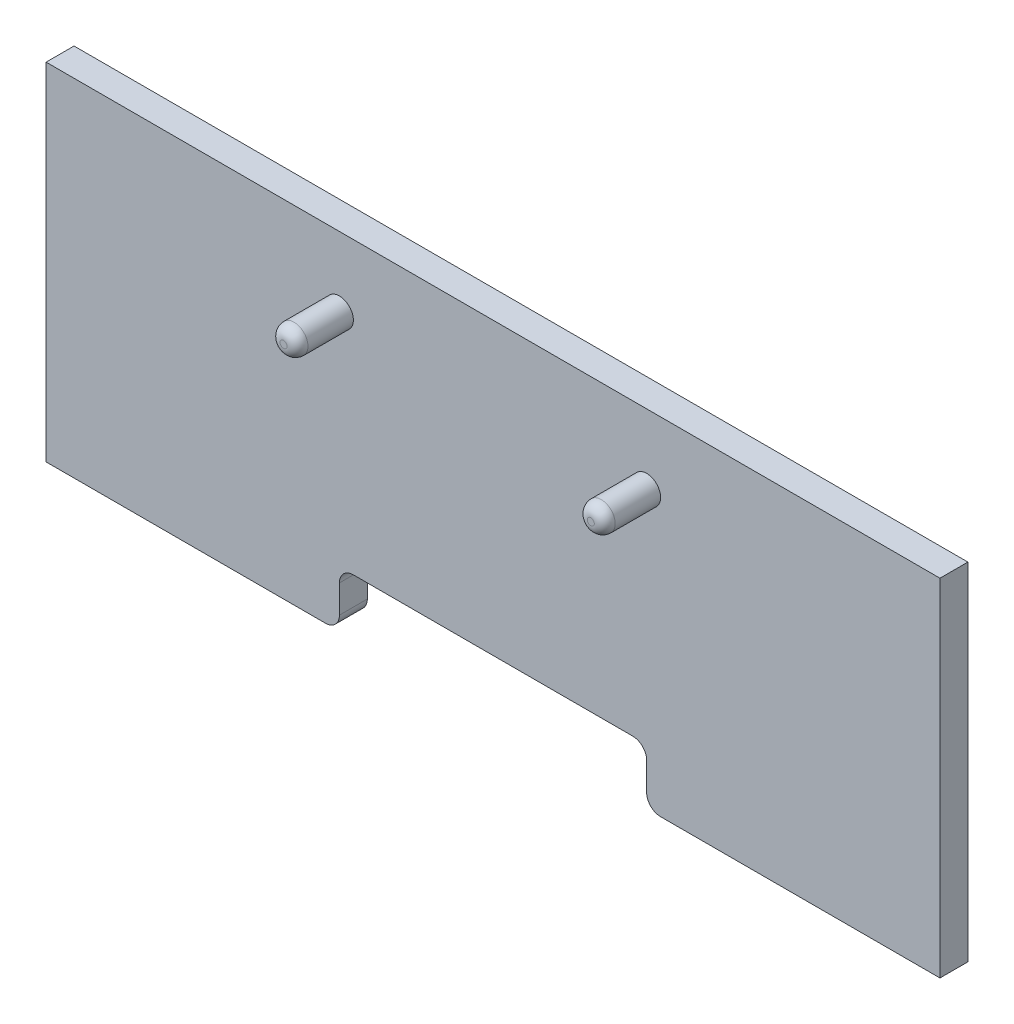
ISO-10303-21;
HEADER;
FILE_DESCRIPTION(('STEP AP214'),'2;1');
FILE_NAME('part.step','',(''),(''),'','','');
FILE_SCHEMA(('AUTOMOTIVE_DESIGN { 1 0 10303 214 1 1 1 1 }'));
ENDSEC;
DATA;
#1=APPLICATION_CONTEXT('core data for automotive mechanical design processes');
#2=APPLICATION_PROTOCOL_DEFINITION('international standard','automotive_design',2000,#1);
#3=PRODUCT_CONTEXT('',#1,'mechanical');
#4=PRODUCT('Part','Part','',(#3));
#5=PRODUCT_RELATED_PRODUCT_CATEGORY('part','',(#4));
#6=PRODUCT_DEFINITION_FORMATION('','',#4);
#7=PRODUCT_DEFINITION_CONTEXT('part definition',#1,'design');
#8=PRODUCT_DEFINITION('design','',#6,#7);
#9=PRODUCT_DEFINITION_SHAPE('','',#8);
#10=(LENGTH_UNIT() NAMED_UNIT(*) SI_UNIT(.MILLI.,.METRE.));
#11=(NAMED_UNIT(*) PLANE_ANGLE_UNIT() SI_UNIT($,.RADIAN.));
#12=(NAMED_UNIT(*) SI_UNIT($,.STERADIAN.) SOLID_ANGLE_UNIT());
#13=UNCERTAINTY_MEASURE_WITH_UNIT(LENGTH_MEASURE(1.E-05),#10,'distance_accuracy_value','');
#14=(GEOMETRIC_REPRESENTATION_CONTEXT(3) GLOBAL_UNCERTAINTY_ASSIGNED_CONTEXT((#13)) GLOBAL_UNIT_ASSIGNED_CONTEXT((#10,
#11,#12)) REPRESENTATION_CONTEXT('',''));
#15=CARTESIAN_POINT('',(0.,0.,0.));
#16=DIRECTION('',(0.,0.,1.));
#17=DIRECTION('',(1.,0.,0.));
#18=AXIS2_PLACEMENT_3D('',#15,#16,#17);
#19=CARTESIAN_POINT('',(0.,0.,6.35));
#20=DIRECTION('',(0.,1.,0.));
#21=DIRECTION('',(0.,0.,1.));
#22=AXIS2_PLACEMENT_3D('',#19,#20,#21);
#23=PLANE('',#22);
#24=DIRECTION('',(1.,0.,0.));
#25=VECTOR('',#24,1.);
#26=CARTESIAN_POINT('',(0.,0.,0.));
#27=LINE('',#26,#25);
#28=CARTESIAN_POINT('',(0.,0.,0.));
#29=VERTEX_POINT('',#28);
#30=CARTESIAN_POINT('',(63.5,0.,0.));
#31=VERTEX_POINT('',#30);
#32=EDGE_CURVE('E309',#29,#31,#27,.T.);
#33=ORIENTED_EDGE('',*,*,#32,.T.);
#34=DIRECTION('',(0.,0.,1.));
#35=VECTOR('',#34,1.);
#36=CARTESIAN_POINT('',(63.5,0.,6.35));
#37=LINE('',#36,#35);
#38=CARTESIAN_POINT('',(63.5,0.,6.35));
#39=VERTEX_POINT('',#38);
#40=EDGE_CURVE('E139',#31,#39,#37,.T.);
#41=ORIENTED_EDGE('',*,*,#40,.T.);
#42=DIRECTION('',(1.,0.,0.));
#43=VECTOR('',#42,1.);
#44=CARTESIAN_POINT('',(0.,0.,6.35));
#45=LINE('',#44,#43);
#46=CARTESIAN_POINT('',(0.,0.,6.35));
#47=VERTEX_POINT('',#46);
#48=EDGE_CURVE('E132',#47,#39,#45,.T.);
#49=ORIENTED_EDGE('',*,*,#48,.F.);
#50=DIRECTION('',(0.,0.,-1.));
#51=VECTOR('',#50,1.);
#52=CARTESIAN_POINT('',(0.,0.,6.35));
#53=LINE('',#52,#51);
#54=EDGE_CURVE('E136',#47,#29,#53,.T.);
#55=ORIENTED_EDGE('',*,*,#54,.T.);
#56=EDGE_LOOP('',(#33,#41,#49,#55));
#57=FACE_BOUND('',#56,.T.);
#58=ADVANCED_FACE('F39',(#57),#23,.F.);
#59=CARTESIAN_POINT('',(0.,0.,6.35));
#60=DIRECTION('',(1.,0.,0.));
#61=DIRECTION('',(0.,0.,-1.));
#62=AXIS2_PLACEMENT_3D('',#59,#60,#61);
#63=PLANE('',#62);
#64=DIRECTION('',(0.,-1.,0.));
#65=VECTOR('',#64,1.);
#66=CARTESIAN_POINT('',(0.,0.,0.));
#67=LINE('',#66,#65);
#68=CARTESIAN_POINT('',(0.,78.7146,0.));
#69=VERTEX_POINT('',#68);
#70=EDGE_CURVE('E159',#69,#29,#67,.T.);
#71=ORIENTED_EDGE('',*,*,#70,.T.);
#72=ORIENTED_EDGE('',*,*,#54,.F.);
#73=DIRECTION('',(0.,-1.,0.));
#74=VECTOR('',#73,1.);
#75=CARTESIAN_POINT('',(0.,0.,6.35));
#76=LINE('',#75,#74);
#77=CARTESIAN_POINT('',(0.,78.7146,6.35));
#78=VERTEX_POINT('',#77);
#79=EDGE_CURVE('E146',#78,#47,#76,.T.);
#80=ORIENTED_EDGE('',*,*,#79,.F.);
#81=DIRECTION('',(0.,0.,-1.));
#82=VECTOR('',#81,1.);
#83=CARTESIAN_POINT('',(0.,78.7146,6.35));
#84=LINE('',#83,#82);
#85=EDGE_CURVE('E306',#78,#69,#84,.T.);
#86=ORIENTED_EDGE('',*,*,#85,.T.);
#87=EDGE_LOOP('',(#71,#72,#80,#86));
#88=FACE_BOUND('',#87,.T.);
#89=ADVANCED_FACE('F157',(#88),#63,.F.);
#90=CARTESIAN_POINT('',(139.7,0.,6.35));
#91=VERTEX_POINT('',#90);
#92=CARTESIAN_POINT('',(203.2,0.,6.35));
#93=VERTEX_POINT('',#92);
#94=EDGE_CURVE('E143',#91,#93,#45,.T.);
#95=ORIENTED_EDGE('',*,*,#94,.F.);
#96=DIRECTION('',(0.,0.,1.));
#97=VECTOR('',#96,1.);
#98=CARTESIAN_POINT('',(139.7,0.,6.35));
#99=LINE('',#98,#97);
#100=CARTESIAN_POINT('',(139.7,0.,0.));
#101=VERTEX_POINT('',#100);
#102=EDGE_CURVE('E182',#91,#101,#99,.F.);
#103=ORIENTED_EDGE('',*,*,#102,.T.);
#104=CARTESIAN_POINT('',(203.2,0.,0.));
#105=VERTEX_POINT('',#104);
#106=EDGE_CURVE('E277',#101,#105,#27,.T.);
#107=ORIENTED_EDGE('',*,*,#106,.T.);
#108=DIRECTION('',(0.,0.,-1.));
#109=VECTOR('',#108,1.);
#110=CARTESIAN_POINT('',(203.2,0.,6.35));
#111=LINE('',#110,#109);
#112=EDGE_CURVE('E162',#93,#105,#111,.T.);
#113=ORIENTED_EDGE('',*,*,#112,.F.);
#114=EDGE_LOOP('',(#95,#103,#107,#113));
#115=FACE_BOUND('',#114,.T.);
#116=ADVANCED_FACE('F249',(#115),#23,.F.);
#117=CARTESIAN_POINT('',(203.2,0.,6.35));
#118=DIRECTION('',(-1.,0.,0.));
#119=DIRECTION('',(0.,0.,1.));
#120=AXIS2_PLACEMENT_3D('',#117,#118,#119);
#121=PLANE('',#120);
#122=DIRECTION('',(0.,1.,0.));
#123=VECTOR('',#122,1.);
#124=CARTESIAN_POINT('',(203.2,0.,0.));
#125=LINE('',#124,#123);
#126=CARTESIAN_POINT('',(203.2,78.7146,0.));
#127=VERTEX_POINT('',#126);
#128=EDGE_CURVE('E312',#105,#127,#125,.T.);
#129=ORIENTED_EDGE('',*,*,#128,.T.);
#130=DIRECTION('',(0.,0.,-1.));
#131=VECTOR('',#130,1.);
#132=CARTESIAN_POINT('',(203.2,78.7146,6.35));
#133=LINE('',#132,#131);
#134=CARTESIAN_POINT('',(203.2,78.7146,6.35));
#135=VERTEX_POINT('',#134);
#136=EDGE_CURVE('E169',#135,#127,#133,.T.);
#137=ORIENTED_EDGE('',*,*,#136,.F.);
#138=DIRECTION('',(0.,1.,0.));
#139=VECTOR('',#138,1.);
#140=CARTESIAN_POINT('',(203.2,0.,6.35));
#141=LINE('',#140,#139);
#142=EDGE_CURVE('E142',#93,#135,#141,.T.);
#143=ORIENTED_EDGE('',*,*,#142,.F.);
#144=ORIENTED_EDGE('',*,*,#112,.T.);
#145=EDGE_LOOP('',(#129,#137,#143,#144));
#146=FACE_BOUND('',#145,.T.);
#147=ADVANCED_FACE('F256',(#146),#121,.F.);
#148=CARTESIAN_POINT('',(0.,78.7146,6.35));
#149=DIRECTION('',(0.,-1.,0.));
#150=DIRECTION('',(0.,0.,-1.));
#151=AXIS2_PLACEMENT_3D('',#148,#149,#150);
#152=PLANE('',#151);
#153=DIRECTION('',(-1.,0.,0.));
#154=VECTOR('',#153,1.);
#155=CARTESIAN_POINT('',(0.,78.7146,0.));
#156=LINE('',#155,#154);
#157=EDGE_CURVE('E155',#127,#69,#156,.T.);
#158=ORIENTED_EDGE('',*,*,#157,.T.);
#159=ORIENTED_EDGE('',*,*,#85,.F.);
#160=DIRECTION('',(-1.,0.,0.));
#161=VECTOR('',#160,1.);
#162=CARTESIAN_POINT('',(0.,78.7146,6.35));
#163=LINE('',#162,#161);
#164=EDGE_CURVE('E150',#135,#78,#163,.T.);
#165=ORIENTED_EDGE('',*,*,#164,.F.);
#166=ORIENTED_EDGE('',*,*,#136,.T.);
#167=EDGE_LOOP('',(#158,#159,#165,#166));
#168=FACE_BOUND('',#167,.T.);
#169=ADVANCED_FACE('F261',(#168),#152,.F.);
#170=CARTESIAN_POINT('',(0.,0.,6.35));
#171=DIRECTION('',(0.,0.,-1.));
#172=DIRECTION('',(-1.,0.,0.));
#173=AXIS2_PLACEMENT_3D('',#170,#171,#172);
#174=PLANE('',#173);
#175=CARTESIAN_POINT('',(136.525,62.8396,6.35));
#176=DIRECTION('',(0.,0.,-1.));
#177=DIRECTION('',(-1.,0.,0.));
#178=AXIS2_PLACEMENT_3D('',#175,#176,#177);
#179=CIRCLE('',#178,3.17499999999997);
#180=CARTESIAN_POINT('',(133.35,62.8396,6.35));
#181=VERTEX_POINT('',#180);
#182=EDGE_CURVE('E221',#181,#181,#179,.F.);
#183=ORIENTED_EDGE('',*,*,#182,.F.);
#184=EDGE_LOOP('',(#183));
#185=FACE_BOUND('',#184,.T.);
#186=CARTESIAN_POINT('',(66.675,62.8396,6.35));
#187=DIRECTION('',(0.,0.,-1.));
#188=DIRECTION('',(-1.,0.,0.));
#189=AXIS2_PLACEMENT_3D('',#186,#187,#188);
#190=CIRCLE('',#189,3.175);
#191=CARTESIAN_POINT('',(63.5,62.8396,6.35));
#192=VERTEX_POINT('',#191);
#193=EDGE_CURVE('E217',#192,#192,#190,.F.);
#194=ORIENTED_EDGE('',*,*,#193,.F.);
#195=EDGE_LOOP('',(#194));
#196=FACE_BOUND('',#195,.T.);
#197=DIRECTION('',(0.,1.,0.));
#198=VECTOR('',#197,1.);
#199=CARTESIAN_POINT('',(136.525,0.,6.35));
#200=LINE('',#199,#198);
#201=CARTESIAN_POINT('',(136.525,3.175,6.35));
#202=VERTEX_POINT('',#201);
#203=CARTESIAN_POINT('',(136.525,9.52500000000001,6.35));
#204=VERTEX_POINT('',#203);
#205=EDGE_CURVE('E297',#202,#204,#200,.T.);
#206=ORIENTED_EDGE('',*,*,#205,.F.);
#207=CARTESIAN_POINT('',(139.7,3.175,6.35));
#208=DIRECTION('',(0.,0.,-1.));
#209=DIRECTION('',(-1.,0.,0.));
#210=AXIS2_PLACEMENT_3D('',#207,#208,#209);
#211=CIRCLE('',#210,3.175);
#212=EDGE_CURVE('E179',#202,#91,#211,.F.);
#213=ORIENTED_EDGE('',*,*,#212,.T.);
#214=ORIENTED_EDGE('',*,*,#94,.T.);
#215=ORIENTED_EDGE('',*,*,#142,.T.);
#216=ORIENTED_EDGE('',*,*,#164,.T.);
#217=ORIENTED_EDGE('',*,*,#79,.T.);
#218=ORIENTED_EDGE('',*,*,#48,.T.);
#219=CARTESIAN_POINT('',(63.5,3.175,6.35));
#220=DIRECTION('',(0.,0.,-1.));
#221=DIRECTION('',(-1.,0.,0.));
#222=AXIS2_PLACEMENT_3D('',#219,#220,#221);
#223=CIRCLE('',#222,3.175);
#224=CARTESIAN_POINT('',(66.675,3.175,6.35));
#225=VERTEX_POINT('',#224);
#226=EDGE_CURVE('E176',#39,#225,#223,.F.);
#227=ORIENTED_EDGE('',*,*,#226,.T.);
#228=DIRECTION('',(0.,-1.,0.));
#229=VECTOR('',#228,1.);
#230=CARTESIAN_POINT('',(66.675,0.,6.35));
#231=LINE('',#230,#229);
#232=CARTESIAN_POINT('',(66.675,9.525,6.35));
#233=VERTEX_POINT('',#232);
#234=EDGE_CURVE('E293',#233,#225,#231,.T.);
#235=ORIENTED_EDGE('',*,*,#234,.F.);
#236=CARTESIAN_POINT('',(69.85,9.525,6.35));
#237=DIRECTION('',(0.,0.,-1.));
#238=DIRECTION('',(-1.,0.,0.));
#239=AXIS2_PLACEMENT_3D('',#236,#237,#238);
#240=CIRCLE('',#239,3.175);
#241=CARTESIAN_POINT('',(69.85,12.7,6.35));
#242=VERTEX_POINT('',#241);
#243=EDGE_CURVE('E211',#233,#242,#240,.T.);
#244=ORIENTED_EDGE('',*,*,#243,.T.);
#245=DIRECTION('',(-1.,0.,0.));
#246=VECTOR('',#245,1.);
#247=CARTESIAN_POINT('',(66.675,12.7,6.35));
#248=LINE('',#247,#246);
#249=CARTESIAN_POINT('',(133.35,12.7,6.35));
#250=VERTEX_POINT('',#249);
#251=EDGE_CURVE('E290',#250,#242,#248,.T.);
#252=ORIENTED_EDGE('',*,*,#251,.F.);
#253=CARTESIAN_POINT('',(133.35,9.52500000000001,6.35));
#254=DIRECTION('',(0.,0.,-1.));
#255=DIRECTION('',(-1.,0.,0.));
#256=AXIS2_PLACEMENT_3D('',#253,#254,#255);
#257=CIRCLE('',#256,3.175);
#258=EDGE_CURVE('E206',#250,#204,#257,.T.);
#259=ORIENTED_EDGE('',*,*,#258,.T.);
#260=EDGE_LOOP('',(#206,#213,#214,#215,#216,#217,#218,#227,#235,#244,#252,#259));
#261=FACE_BOUND('',#260,.T.);
#262=ADVANCED_FACE('F148',(#185,#196,#261),#174,.F.);
#263=CARTESIAN_POINT('',(0.,0.,0.));
#264=DIRECTION('',(0.,0.,-1.));
#265=DIRECTION('',(-1.,0.,0.));
#266=AXIS2_PLACEMENT_3D('',#263,#264,#265);
#267=PLANE('',#266);
#268=ORIENTED_EDGE('',*,*,#106,.F.);
#269=CARTESIAN_POINT('',(139.7,3.175,0.));
#270=DIRECTION('',(0.,0.,-1.));
#271=DIRECTION('',(-1.,0.,0.));
#272=AXIS2_PLACEMENT_3D('',#269,#270,#271);
#273=CIRCLE('',#272,3.175);
#274=CARTESIAN_POINT('',(136.525,3.175,0.));
#275=VERTEX_POINT('',#274);
#276=EDGE_CURVE('E188',#101,#275,#273,.T.);
#277=ORIENTED_EDGE('',*,*,#276,.T.);
#278=DIRECTION('',(0.,1.,0.));
#279=VECTOR('',#278,1.);
#280=CARTESIAN_POINT('',(136.525,0.,0.));
#281=LINE('',#280,#279);
#282=CARTESIAN_POINT('',(136.525,9.52500000000001,0.));
#283=VERTEX_POINT('',#282);
#284=EDGE_CURVE('E275',#275,#283,#281,.T.);
#285=ORIENTED_EDGE('',*,*,#284,.T.);
#286=CARTESIAN_POINT('',(133.35,9.52500000000001,0.));
#287=DIRECTION('',(0.,0.,-1.));
#288=DIRECTION('',(-1.,0.,0.));
#289=AXIS2_PLACEMENT_3D('',#286,#287,#288);
#290=CIRCLE('',#289,3.175);
#291=CARTESIAN_POINT('',(133.35,12.7,0.));
#292=VERTEX_POINT('',#291);
#293=EDGE_CURVE('E62',#283,#292,#290,.F.);
#294=ORIENTED_EDGE('',*,*,#293,.T.);
#295=DIRECTION('',(-1.,0.,0.));
#296=VECTOR('',#295,1.);
#297=CARTESIAN_POINT('',(66.675,12.7,0.));
#298=LINE('',#297,#296);
#299=CARTESIAN_POINT('',(69.85,12.7,0.));
#300=VERTEX_POINT('',#299);
#301=EDGE_CURVE('E283',#292,#300,#298,.T.);
#302=ORIENTED_EDGE('',*,*,#301,.T.);
#303=CARTESIAN_POINT('',(69.85,9.525,0.));
#304=DIRECTION('',(0.,0.,-1.));
#305=DIRECTION('',(-1.,0.,0.));
#306=AXIS2_PLACEMENT_3D('',#303,#304,#305);
#307=CIRCLE('',#306,3.175);
#308=CARTESIAN_POINT('',(66.675,9.525,0.));
#309=VERTEX_POINT('',#308);
#310=EDGE_CURVE('E214',#300,#309,#307,.F.);
#311=ORIENTED_EDGE('',*,*,#310,.T.);
#312=DIRECTION('',(0.,-1.,0.));
#313=VECTOR('',#312,1.);
#314=CARTESIAN_POINT('',(66.675,0.,0.));
#315=LINE('',#314,#313);
#316=CARTESIAN_POINT('',(66.675,3.175,0.));
#317=VERTEX_POINT('',#316);
#318=EDGE_CURVE('E284',#309,#317,#315,.T.);
#319=ORIENTED_EDGE('',*,*,#318,.T.);
#320=CARTESIAN_POINT('',(63.5,3.175,0.));
#321=DIRECTION('',(0.,0.,-1.));
#322=DIRECTION('',(-1.,0.,0.));
#323=AXIS2_PLACEMENT_3D('',#320,#321,#322);
#324=CIRCLE('',#323,3.175);
#325=EDGE_CURVE('E185',#317,#31,#324,.T.);
#326=ORIENTED_EDGE('',*,*,#325,.T.);
#327=ORIENTED_EDGE('',*,*,#32,.F.);
#328=ORIENTED_EDGE('',*,*,#70,.F.);
#329=ORIENTED_EDGE('',*,*,#157,.F.);
#330=ORIENTED_EDGE('',*,*,#128,.F.);
#331=EDGE_LOOP('',(#268,#277,#285,#294,#302,#311,#319,#326,#327,#328,#329,#330));
#332=FACE_BOUND('',#331,.T.);
#333=ADVANCED_FACE('F274',(#332),#267,.T.);
#334=CARTESIAN_POINT('',(66.675,0.,0.));
#335=DIRECTION('',(-1.,0.,0.));
#336=DIRECTION('',(0.,0.,1.));
#337=AXIS2_PLACEMENT_3D('',#334,#335,#336);
#338=PLANE('',#337);
#339=ORIENTED_EDGE('',*,*,#318,.F.);
#340=DIRECTION('',(0.,0.,1.));
#341=VECTOR('',#340,1.);
#342=CARTESIAN_POINT('',(66.675,9.525,6.35));
#343=LINE('',#342,#341);
#344=EDGE_CURVE('E200',#309,#233,#343,.T.);
#345=ORIENTED_EDGE('',*,*,#344,.T.);
#346=ORIENTED_EDGE('',*,*,#234,.T.);
#347=DIRECTION('',(0.,0.,1.));
#348=VECTOR('',#347,1.);
#349=CARTESIAN_POINT('',(66.675,3.175,0.));
#350=LINE('',#349,#348);
#351=EDGE_CURVE('E197',#225,#317,#350,.F.);
#352=ORIENTED_EDGE('',*,*,#351,.T.);
#353=EDGE_LOOP('',(#339,#345,#346,#352));
#354=FACE_BOUND('',#353,.T.);
#355=ADVANCED_FACE('F330',(#354),#338,.F.);
#356=CARTESIAN_POINT('',(66.675,12.7,0.));
#357=DIRECTION('',(0.,1.,0.));
#358=DIRECTION('',(-1.,0.,0.));
#359=AXIS2_PLACEMENT_3D('',#356,#357,#358);
#360=PLANE('',#359);
#361=ORIENTED_EDGE('',*,*,#301,.F.);
#362=DIRECTION('',(0.,0.,1.));
#363=VECTOR('',#362,1.);
#364=CARTESIAN_POINT('',(133.35,12.7,6.35));
#365=LINE('',#364,#363);
#366=EDGE_CURVE('E193',#292,#250,#365,.T.);
#367=ORIENTED_EDGE('',*,*,#366,.T.);
#368=ORIENTED_EDGE('',*,*,#251,.T.);
#369=DIRECTION('',(0.,0.,1.));
#370=VECTOR('',#369,1.);
#371=CARTESIAN_POINT('',(69.85,12.7,0.));
#372=LINE('',#371,#370);
#373=EDGE_CURVE('E55',#242,#300,#372,.F.);
#374=ORIENTED_EDGE('',*,*,#373,.T.);
#375=EDGE_LOOP('',(#361,#367,#368,#374));
#376=FACE_BOUND('',#375,.T.);
#377=ADVANCED_FACE('F336',(#376),#360,.F.);
#378=CARTESIAN_POINT('',(136.525,0.,0.));
#379=DIRECTION('',(1.,0.,0.));
#380=DIRECTION('',(0.,0.,-1.));
#381=AXIS2_PLACEMENT_3D('',#378,#379,#380);
#382=PLANE('',#381);
#383=ORIENTED_EDGE('',*,*,#284,.F.);
#384=DIRECTION('',(0.,0.,1.));
#385=VECTOR('',#384,1.);
#386=CARTESIAN_POINT('',(136.525,3.175,0.));
#387=LINE('',#386,#385);
#388=EDGE_CURVE('E166',#275,#202,#387,.T.);
#389=ORIENTED_EDGE('',*,*,#388,.T.);
#390=ORIENTED_EDGE('',*,*,#205,.T.);
#391=DIRECTION('',(0.,0.,1.));
#392=VECTOR('',#391,1.);
#393=CARTESIAN_POINT('',(136.525,9.52500000000001,0.));
#394=LINE('',#393,#392);
#395=EDGE_CURVE('E161',#204,#283,#394,.F.);
#396=ORIENTED_EDGE('',*,*,#395,.T.);
#397=EDGE_LOOP('',(#383,#389,#390,#396));
#398=FACE_BOUND('',#397,.T.);
#399=ADVANCED_FACE('F279',(#398),#382,.F.);
#400=CARTESIAN_POINT('',(139.7,3.175,0.));
#401=DIRECTION('',(0.,0.,1.));
#402=DIRECTION('',(1.,0.,0.));
#403=AXIS2_PLACEMENT_3D('',#400,#401,#402);
#404=CYLINDRICAL_SURFACE('',#403,3.175);
#405=ORIENTED_EDGE('',*,*,#276,.F.);
#406=ORIENTED_EDGE('',*,*,#102,.F.);
#407=ORIENTED_EDGE('',*,*,#212,.F.);
#408=ORIENTED_EDGE('',*,*,#388,.F.);
#409=EDGE_LOOP('',(#405,#406,#407,#408));
#410=FACE_BOUND('',#409,.T.);
#411=ADVANCED_FACE('F271',(#410),#404,.T.);
#412=CARTESIAN_POINT('',(133.35,9.52500000000001,0.));
#413=DIRECTION('',(0.,0.,-1.));
#414=DIRECTION('',(-1.,0.,0.));
#415=AXIS2_PLACEMENT_3D('',#412,#413,#414);
#416=CYLINDRICAL_SURFACE('',#415,3.175);
#417=ORIENTED_EDGE('',*,*,#293,.F.);
#418=ORIENTED_EDGE('',*,*,#395,.F.);
#419=ORIENTED_EDGE('',*,*,#258,.F.);
#420=ORIENTED_EDGE('',*,*,#366,.F.);
#421=EDGE_LOOP('',(#417,#418,#419,#420));
#422=FACE_BOUND('',#421,.T.);
#423=ADVANCED_FACE('F339',(#422),#416,.F.);
#424=CARTESIAN_POINT('',(69.85,9.525,0.));
#425=DIRECTION('',(0.,0.,-1.));
#426=DIRECTION('',(-1.,0.,0.));
#427=AXIS2_PLACEMENT_3D('',#424,#425,#426);
#428=CYLINDRICAL_SURFACE('',#427,3.175);
#429=ORIENTED_EDGE('',*,*,#310,.F.);
#430=ORIENTED_EDGE('',*,*,#373,.F.);
#431=ORIENTED_EDGE('',*,*,#243,.F.);
#432=ORIENTED_EDGE('',*,*,#344,.F.);
#433=EDGE_LOOP('',(#429,#430,#431,#432));
#434=FACE_BOUND('',#433,.T.);
#435=ADVANCED_FACE('F334',(#434),#428,.F.);
#436=CARTESIAN_POINT('',(63.5,3.175,6.35));
#437=DIRECTION('',(0.,0.,1.));
#438=DIRECTION('',(1.,0.,0.));
#439=AXIS2_PLACEMENT_3D('',#436,#437,#438);
#440=CYLINDRICAL_SURFACE('',#439,3.175);
#441=ORIENTED_EDGE('',*,*,#325,.F.);
#442=ORIENTED_EDGE('',*,*,#351,.F.);
#443=ORIENTED_EDGE('',*,*,#226,.F.);
#444=ORIENTED_EDGE('',*,*,#40,.F.);
#445=EDGE_LOOP('',(#441,#442,#443,#444));
#446=FACE_BOUND('',#445,.T.);
#447=ADVANCED_FACE('F325',(#446),#440,.T.);
#448=CARTESIAN_POINT('',(66.675,62.8396,19.05));
#449=DIRECTION('',(0.,0.,-1.));
#450=DIRECTION('',(-1.,0.,0.));
#451=AXIS2_PLACEMENT_3D('',#448,#449,#450);
#452=CYLINDRICAL_SURFACE('',#451,3.175);
#453=CARTESIAN_POINT('',(66.675,62.8396,16.66875));
#454=DIRECTION('',(0.,0.,1.));
#455=DIRECTION('',(1.,0.,0.));
#456=AXIS2_PLACEMENT_3D('',#453,#454,#455);
#457=CIRCLE('',#456,3.175);
#458=CARTESIAN_POINT('',(69.85,62.8396,16.66875));
#459=VERTEX_POINT('',#458);
#460=EDGE_CURVE('E11',#459,#459,#457,.F.);
#461=ORIENTED_EDGE('',*,*,#460,.T.);
#462=EDGE_LOOP('',(#461));
#463=FACE_BOUND('',#462,.T.);
#464=ORIENTED_EDGE('',*,*,#193,.T.);
#465=EDGE_LOOP('',(#464));
#466=FACE_BOUND('',#465,.T.);
#467=ADVANCED_FACE('F350',(#463,#466),#452,.T.);
#468=CARTESIAN_POINT('',(66.675,62.8396,19.05));
#469=DIRECTION('',(0.,0.,1.));
#470=DIRECTION('',(1.,0.,0.));
#471=AXIS2_PLACEMENT_3D('',#468,#469,#470);
#472=PLANE('',#471);
#473=CARTESIAN_POINT('',(66.675,62.8396,19.05));
#474=DIRECTION('',(0.,0.,1.));
#475=DIRECTION('',(1.,0.,0.));
#476=AXIS2_PLACEMENT_3D('',#473,#474,#475);
#477=CIRCLE('',#476,0.793749999999997);
#478=CARTESIAN_POINT('',(67.46875,62.8396,19.05));
#479=VERTEX_POINT('',#478);
#480=EDGE_CURVE('E48',#479,#479,#477,.T.);
#481=ORIENTED_EDGE('',*,*,#480,.T.);
#482=EDGE_LOOP('',(#481));
#483=FACE_BOUND('',#482,.T.);
#484=ADVANCED_FACE('F236',(#483),#472,.T.);
#485=CARTESIAN_POINT('',(136.525,62.8396,19.05));
#486=DIRECTION('',(0.,0.,-1.));
#487=DIRECTION('',(-1.,0.,0.));
#488=AXIS2_PLACEMENT_3D('',#485,#486,#487);
#489=CYLINDRICAL_SURFACE('',#488,3.17499999999997);
#490=CARTESIAN_POINT('',(136.525,62.8396,16.66875));
#491=DIRECTION('',(0.,0.,1.));
#492=DIRECTION('',(1.,0.,0.));
#493=AXIS2_PLACEMENT_3D('',#490,#491,#492);
#494=CIRCLE('',#493,3.17499999999997);
#495=CARTESIAN_POINT('',(139.7,62.8396,16.66875));
#496=VERTEX_POINT('',#495);
#497=EDGE_CURVE('E229',#496,#496,#494,.F.);
#498=ORIENTED_EDGE('',*,*,#497,.T.);
#499=EDGE_LOOP('',(#498));
#500=FACE_BOUND('',#499,.T.);
#501=ORIENTED_EDGE('',*,*,#182,.T.);
#502=EDGE_LOOP('',(#501));
#503=FACE_BOUND('',#502,.T.);
#504=ADVANCED_FACE('F359',(#500,#503),#489,.T.);
#505=CARTESIAN_POINT('',(136.525,62.8396,19.05));
#506=DIRECTION('',(0.,0.,1.));
#507=DIRECTION('',(1.,0.,0.));
#508=AXIS2_PLACEMENT_3D('',#505,#506,#507);
#509=PLANE('',#508);
#510=CARTESIAN_POINT('',(136.525,62.8396,19.05));
#511=DIRECTION('',(0.,0.,1.));
#512=DIRECTION('',(1.,0.,0.));
#513=AXIS2_PLACEMENT_3D('',#510,#511,#512);
#514=CIRCLE('',#513,0.793749999999971);
#515=CARTESIAN_POINT('',(137.31875,62.8396,19.05));
#516=VERTEX_POINT('',#515);
#517=EDGE_CURVE('E225',#516,#516,#514,.T.);
#518=ORIENTED_EDGE('',*,*,#517,.T.);
#519=EDGE_LOOP('',(#518));
#520=FACE_BOUND('',#519,.T.);
#521=ADVANCED_FACE('F244',(#520),#509,.T.);
#522=CARTESIAN_POINT('',(136.525,62.8396,16.66875));
#523=DIRECTION('',(0.,0.,1.));
#524=DIRECTION('',(1.,0.,0.));
#525=AXIS2_PLACEMENT_3D('',#522,#523,#524);
#526=DEGENERATE_TOROIDAL_SURFACE('',#525,0.793749999999971,2.38125,.T.);
#527=ORIENTED_EDGE('',*,*,#497,.F.);
#528=EDGE_LOOP('',(#527));
#529=FACE_BOUND('',#528,.T.);
#530=ORIENTED_EDGE('',*,*,#517,.F.);
#531=EDGE_LOOP('',(#530));
#532=FACE_BOUND('',#531,.T.);
#533=ADVANCED_FACE('F239',(#529,#532),#526,.T.);
#534=CARTESIAN_POINT('',(66.675,62.8396,16.66875));
#535=DIRECTION('',(0.,0.,1.));
#536=DIRECTION('',(1.,0.,0.));
#537=AXIS2_PLACEMENT_3D('',#534,#535,#536);
#538=DEGENERATE_TOROIDAL_SURFACE('',#537,0.793749999999997,2.38125,.T.);
#539=ORIENTED_EDGE('',*,*,#460,.F.);
#540=EDGE_LOOP('',(#539));
#541=FACE_BOUND('',#540,.T.);
#542=ORIENTED_EDGE('',*,*,#480,.F.);
#543=EDGE_LOOP('',(#542));
#544=FACE_BOUND('',#543,.T.);
#545=ADVANCED_FACE('F41',(#541,#544),#538,.T.);
#546=CLOSED_SHELL('',(#58,#89,#116,#147,#169,#262,#333,#355,#377,#399,#411,#423,#435,#447,#467,
#484,#504,#521,#533,#545));
#547=MANIFOLD_SOLID_BREP('B2',#546);
#548=ADVANCED_BREP_SHAPE_REPRESENTATION('',(#18,#547),#14);
#549=SHAPE_DEFINITION_REPRESENTATION(#9,#548);
ENDSEC;
END-ISO-10303-21;
